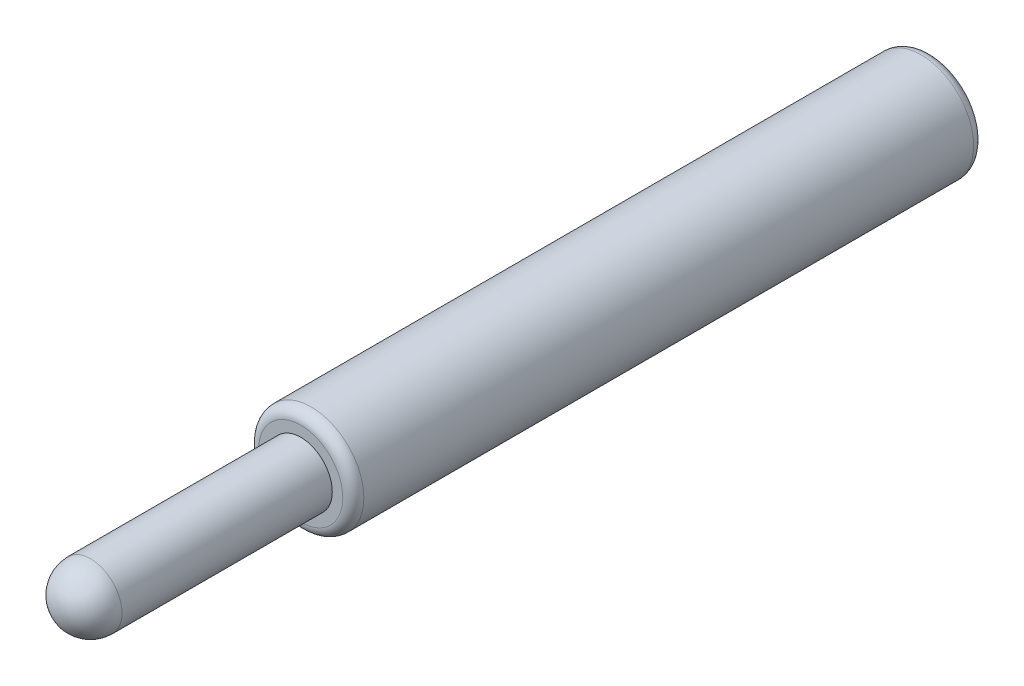
ISO-10303-21;
HEADER;
FILE_DESCRIPTION(('STEP AP214'),'2;1');
FILE_NAME('part.step','',(''),(''),'','','');
FILE_SCHEMA(('AUTOMOTIVE_DESIGN { 1 0 10303 214 1 1 1 1 }'));
ENDSEC;
DATA;
#1=APPLICATION_CONTEXT('core data for automotive mechanical design processes');
#2=APPLICATION_PROTOCOL_DEFINITION('international standard','automotive_design',2000,#1);
#3=PRODUCT_CONTEXT('',#1,'mechanical');
#4=PRODUCT('Part','Part','',(#3));
#5=PRODUCT_RELATED_PRODUCT_CATEGORY('part','',(#4));
#6=PRODUCT_DEFINITION_FORMATION('','',#4);
#7=PRODUCT_DEFINITION_CONTEXT('part definition',#1,'design');
#8=PRODUCT_DEFINITION('design','',#6,#7);
#9=PRODUCT_DEFINITION_SHAPE('','',#8);
#10=(LENGTH_UNIT() NAMED_UNIT(*) SI_UNIT(.MILLI.,.METRE.));
#11=(NAMED_UNIT(*) PLANE_ANGLE_UNIT() SI_UNIT($,.RADIAN.));
#12=(NAMED_UNIT(*) SI_UNIT($,.STERADIAN.) SOLID_ANGLE_UNIT());
#13=UNCERTAINTY_MEASURE_WITH_UNIT(LENGTH_MEASURE(1.E-05),#10,'distance_accuracy_value','');
#14=(GEOMETRIC_REPRESENTATION_CONTEXT(3) GLOBAL_UNCERTAINTY_ASSIGNED_CONTEXT((#13)) GLOBAL_UNIT_ASSIGNED_CONTEXT((#10,
#11,#12)) REPRESENTATION_CONTEXT('',''));
#15=CARTESIAN_POINT('',(0.,0.,0.));
#16=DIRECTION('',(0.,0.,1.));
#17=DIRECTION('',(1.,0.,0.));
#18=AXIS2_PLACEMENT_3D('',#15,#16,#17);
#19=CARTESIAN_POINT('',(0.,0.,-60.));
#20=DIRECTION('',(0.,0.,1.));
#21=DIRECTION('',(1.,0.,0.));
#22=AXIS2_PLACEMENT_3D('',#19,#20,#21);
#23=CYLINDRICAL_SURFACE('',#22,5.);
#24=CARTESIAN_POINT('',(0.,0.,-59.));
#25=DIRECTION('',(0.,0.,1.));
#26=DIRECTION('',(1.,0.,0.));
#27=AXIS2_PLACEMENT_3D('',#24,#25,#26);
#28=CIRCLE('',#27,5.);
#29=CARTESIAN_POINT('',(5.,0.,-59.));
#30=VERTEX_POINT('',#29);
#31=EDGE_CURVE('E46',#30,#30,#28,.T.);
#32=ORIENTED_EDGE('',*,*,#31,.T.);
#33=EDGE_LOOP('',(#32));
#34=FACE_BOUND('',#33,.T.);
#35=CARTESIAN_POINT('',(0.,0.,-1.));
#36=DIRECTION('',(0.,0.,1.));
#37=DIRECTION('',(1.,0.,0.));
#38=AXIS2_PLACEMENT_3D('',#35,#36,#37);
#39=CIRCLE('',#38,5.);
#40=CARTESIAN_POINT('',(5.,0.,-1.));
#41=VERTEX_POINT('',#40);
#42=EDGE_CURVE('E50',#41,#41,#39,.F.);
#43=ORIENTED_EDGE('',*,*,#42,.T.);
#44=EDGE_LOOP('',(#43));
#45=FACE_BOUND('',#44,.T.);
#46=ADVANCED_FACE('F35',(#34,#45),#23,.T.);
#47=CARTESIAN_POINT('',(0.,0.,-60.));
#48=DIRECTION('',(0.,0.,1.));
#49=DIRECTION('',(1.,0.,0.));
#50=AXIS2_PLACEMENT_3D('',#47,#48,#49);
#51=PLANE('',#50);
#52=CARTESIAN_POINT('',(0.,0.,-60.));
#53=DIRECTION('',(0.,0.,1.));
#54=DIRECTION('',(1.,0.,0.));
#55=AXIS2_PLACEMENT_3D('',#52,#53,#54);
#56=CIRCLE('',#55,4.);
#57=CARTESIAN_POINT('',(4.,0.,-60.));
#58=VERTEX_POINT('',#57);
#59=EDGE_CURVE('E42',#58,#58,#56,.F.);
#60=ORIENTED_EDGE('',*,*,#59,.T.);
#61=EDGE_LOOP('',(#60));
#62=FACE_BOUND('',#61,.T.);
#63=ADVANCED_FACE('F73',(#62),#51,.F.);
#64=CARTESIAN_POINT('',(0.,0.,0.));
#65=DIRECTION('',(0.,0.,1.));
#66=DIRECTION('',(1.,0.,0.));
#67=AXIS2_PLACEMENT_3D('',#64,#65,#66);
#68=PLANE('',#67);
#69=CARTESIAN_POINT('',(0.,0.,0.));
#70=DIRECTION('',(0.,0.,1.));
#71=DIRECTION('',(1.,0.,0.));
#72=AXIS2_PLACEMENT_3D('',#69,#70,#71);
#73=CIRCLE('',#72,4.);
#74=CARTESIAN_POINT('',(4.,0.,0.));
#75=VERTEX_POINT('',#74);
#76=EDGE_CURVE('E10',#75,#75,#73,.T.);
#77=ORIENTED_EDGE('',*,*,#76,.T.);
#78=EDGE_LOOP('',(#77));
#79=FACE_BOUND('',#78,.T.);
#80=CARTESIAN_POINT('',(0.,0.,0.));
#81=DIRECTION('',(0.,0.,1.));
#82=DIRECTION('',(1.,0.,0.));
#83=AXIS2_PLACEMENT_3D('',#80,#81,#82);
#84=CIRCLE('',#83,3.);
#85=CARTESIAN_POINT('',(3.,0.,0.));
#86=VERTEX_POINT('',#85);
#87=EDGE_CURVE('E55',#86,#86,#84,.T.);
#88=ORIENTED_EDGE('',*,*,#87,.F.);
#89=EDGE_LOOP('',(#88));
#90=FACE_BOUND('',#89,.T.);
#91=ADVANCED_FACE('F68',(#79,#90),#68,.T.);
#92=CARTESIAN_POINT('',(0.,0.,20.));
#93=DIRECTION('',(0.,0.,-1.));
#94=DIRECTION('',(-1.,0.,0.));
#95=AXIS2_PLACEMENT_3D('',#92,#93,#94);
#96=CYLINDRICAL_SURFACE('',#95,3.);
#97=CARTESIAN_POINT('',(0.,0.,20.));
#98=DIRECTION('',(0.,0.,1.));
#99=DIRECTION('',(1.,0.,0.));
#100=AXIS2_PLACEMENT_3D('',#97,#98,#99);
#101=CIRCLE('',#100,3.);
#102=CARTESIAN_POINT('',(3.,0.,20.));
#103=VERTEX_POINT('',#102);
#104=EDGE_CURVE('E58',#103,#103,#101,.T.);
#105=ORIENTED_EDGE('',*,*,#104,.F.);
#106=EDGE_LOOP('',(#105));
#107=FACE_BOUND('',#106,.T.);
#108=ORIENTED_EDGE('',*,*,#87,.T.);
#109=EDGE_LOOP('',(#108));
#110=FACE_BOUND('',#109,.T.);
#111=ADVANCED_FACE('F64',(#107,#110),#96,.T.);
#112=CARTESIAN_POINT('',(0.,0.,-59.));
#113=DIRECTION('',(0.,0.,1.));
#114=DIRECTION('',(1.,0.,0.));
#115=AXIS2_PLACEMENT_3D('',#112,#113,#114);
#116=TOROIDAL_SURFACE('',#115,4.,1.);
#117=ORIENTED_EDGE('',*,*,#59,.F.);
#118=EDGE_LOOP('',(#117));
#119=FACE_BOUND('',#118,.T.);
#120=ORIENTED_EDGE('',*,*,#31,.F.);
#121=EDGE_LOOP('',(#120));
#122=FACE_BOUND('',#121,.T.);
#123=ADVANCED_FACE('F67',(#119,#122),#116,.T.);
#124=CARTESIAN_POINT('',(0.,0.,-1.));
#125=DIRECTION('',(0.,0.,1.));
#126=DIRECTION('',(1.,0.,0.));
#127=AXIS2_PLACEMENT_3D('',#124,#125,#126);
#128=TOROIDAL_SURFACE('',#127,4.,1.);
#129=ORIENTED_EDGE('',*,*,#42,.F.);
#130=EDGE_LOOP('',(#129));
#131=FACE_BOUND('',#130,.T.);
#132=ORIENTED_EDGE('',*,*,#76,.F.);
#133=EDGE_LOOP('',(#132));
#134=FACE_BOUND('',#133,.T.);
#135=ADVANCED_FACE('F37',(#131,#134),#128,.T.);
#136=CARTESIAN_POINT('',(0.,0.,20.));
#137=DIRECTION('',(0.,0.,1.));
#138=DIRECTION('',(0.,1.,0.));
#139=AXIS2_PLACEMENT_3D('',#136,#137,#138);
#140=SPHERICAL_SURFACE('',#139,3.);
#141=ORIENTED_EDGE('',*,*,#104,.T.);
#142=EDGE_LOOP('',(#141));
#143=FACE_BOUND('',#142,.T.);
#144=ADVANCED_FACE('F62',(#143),#140,.T.);
#145=CLOSED_SHELL('',(#46,#63,#91,#111,#123,#135,#144));
#146=MANIFOLD_SOLID_BREP('B2',#145);
#147=ADVANCED_BREP_SHAPE_REPRESENTATION('',(#18,#146),#14);
#148=SHAPE_DEFINITION_REPRESENTATION(#9,#147);
ENDSEC;
END-ISO-10303-21;
